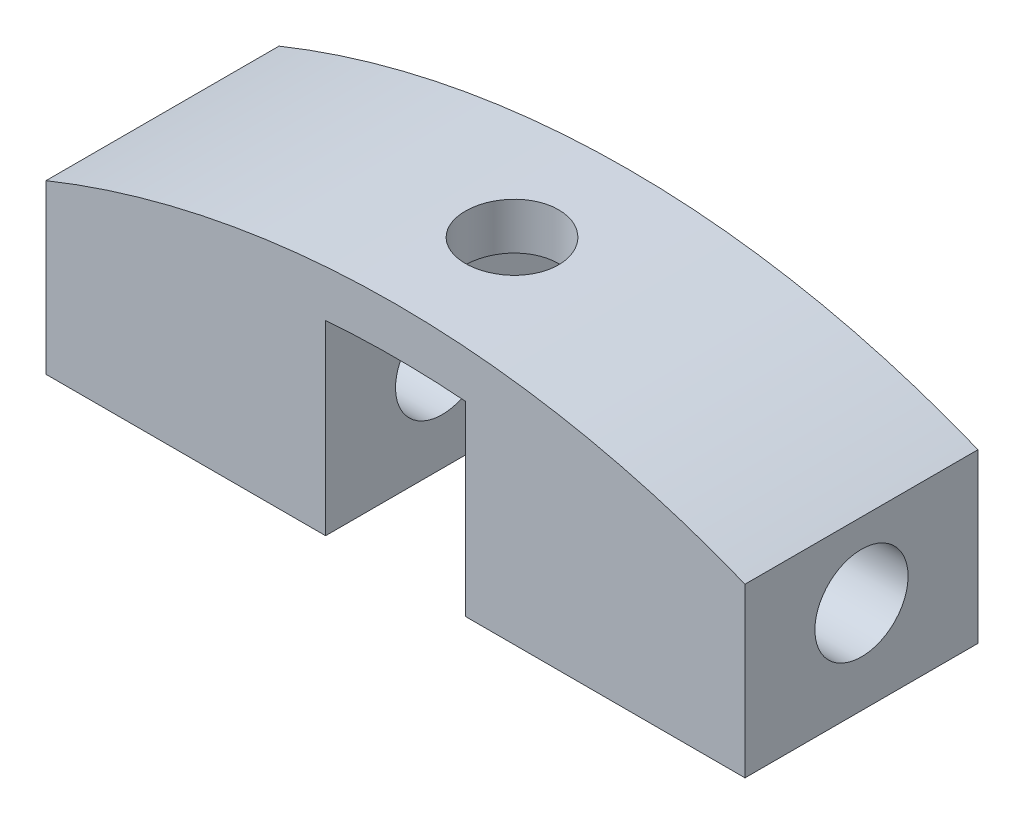
ISO-10303-21;
HEADER;
FILE_DESCRIPTION(('STEP AP214'),'2;1');
FILE_NAME('part.step','',(''),(''),'','','');
FILE_SCHEMA(('AUTOMOTIVE_DESIGN { 1 0 10303 214 1 1 1 1 }'));
ENDSEC;
DATA;
#1=APPLICATION_CONTEXT('core data for automotive mechanical design processes');
#2=APPLICATION_PROTOCOL_DEFINITION('international standard','automotive_design',2000,#1);
#3=PRODUCT_CONTEXT('',#1,'mechanical');
#4=PRODUCT('Part','Part','',(#3));
#5=PRODUCT_RELATED_PRODUCT_CATEGORY('part','',(#4));
#6=PRODUCT_DEFINITION_FORMATION('','',#4);
#7=PRODUCT_DEFINITION_CONTEXT('part definition',#1,'design');
#8=PRODUCT_DEFINITION('design','',#6,#7);
#9=PRODUCT_DEFINITION_SHAPE('','',#8);
#10=(LENGTH_UNIT() NAMED_UNIT(*) SI_UNIT(.MILLI.,.METRE.));
#11=(NAMED_UNIT(*) PLANE_ANGLE_UNIT() SI_UNIT($,.RADIAN.));
#12=(NAMED_UNIT(*) SI_UNIT($,.STERADIAN.) SOLID_ANGLE_UNIT());
#13=UNCERTAINTY_MEASURE_WITH_UNIT(LENGTH_MEASURE(1.E-05),#10,'distance_accuracy_value','');
#14=(GEOMETRIC_REPRESENTATION_CONTEXT(3) GLOBAL_UNCERTAINTY_ASSIGNED_CONTEXT((#13)) GLOBAL_UNIT_ASSIGNED_CONTEXT((#10,
#11,#12)) REPRESENTATION_CONTEXT('',''));
#15=CARTESIAN_POINT('',(0.,0.,0.));
#16=DIRECTION('',(0.,0.,1.));
#17=DIRECTION('',(1.,0.,0.));
#18=AXIS2_PLACEMENT_3D('',#15,#16,#17);
#19=CARTESIAN_POINT('',(0.,0.,-10.));
#20=DIRECTION('',(0.,0.,1.));
#21=DIRECTION('',(1.,0.,0.));
#22=AXIS2_PLACEMENT_3D('',#19,#20,#21);
#23=CYLINDRICAL_SURFACE('',#22,40.);
#24=CARTESIAN_POINT('',(0.,0.,0.));
#25=DIRECTION('',(0.,0.,1.));
#26=DIRECTION('',(1.,0.,0.));
#27=AXIS2_PLACEMENT_3D('',#24,#25,#26);
#28=CIRCLE('',#27,40.);
#29=CARTESIAN_POINT('',(-15.,37.0809924354783,0.));
#30=VERTEX_POINT('',#29);
#31=CARTESIAN_POINT('',(15.,37.0809924354783,0.));
#32=VERTEX_POINT('',#31);
#33=EDGE_CURVE('E147',#30,#32,#28,.F.);
#34=ORIENTED_EDGE('',*,*,#33,.T.);
#35=DIRECTION('',(0.,0.,1.));
#36=VECTOR('',#35,1.);
#37=CARTESIAN_POINT('',(15.,37.0809924354783,-10.));
#38=LINE('',#37,#36);
#39=CARTESIAN_POINT('',(15.,37.0809924354783,-10.));
#40=VERTEX_POINT('',#39);
#41=EDGE_CURVE('E11',#40,#32,#38,.T.);
#42=ORIENTED_EDGE('',*,*,#41,.F.);
#43=CARTESIAN_POINT('',(0.,0.,-10.));
#44=DIRECTION('',(0.,0.,1.));
#45=DIRECTION('',(1.,0.,0.));
#46=AXIS2_PLACEMENT_3D('',#43,#44,#45);
#47=CIRCLE('',#46,40.);
#48=CARTESIAN_POINT('',(-15.,37.0809924354783,-10.));
#49=VERTEX_POINT('',#48);
#50=EDGE_CURVE('E67',#49,#40,#47,.F.);
#51=ORIENTED_EDGE('',*,*,#50,.F.);
#52=DIRECTION('',(0.,0.,1.));
#53=VECTOR('',#52,1.);
#54=CARTESIAN_POINT('',(-15.,37.0809924354783,-10.));
#55=LINE('',#54,#53);
#56=EDGE_CURVE('E108',#49,#30,#55,.T.);
#57=ORIENTED_EDGE('',*,*,#56,.T.);
#58=EDGE_LOOP('',(#34,#42,#51,#57));
#59=FACE_BOUND('',#58,.T.);
#60=CARTESIAN_POINT('',(0.,40.,-7.));
#61=CARTESIAN_POINT('',(-0.112265616911048,39.9999993310588,-6.99999504538615));
#62=CARTESIAN_POINT('',(-0.224610849133379,39.9995223042568,-6.99051557564883));
#63=CARTESIAN_POINT('',(-0.446202106970096,39.9976652092002,-6.95283452638573));
#64=CARTESIAN_POINT('',(-0.555444322678372,39.9962840769828,-6.9246108879087));
#65=CARTESIAN_POINT('',(-0.767587516753999,39.992775092088,-6.85025159445374));
#66=CARTESIAN_POINT('',(-0.870491695889496,39.9906476200151,-6.80412506798111));
#67=CARTESIAN_POINT('',(-1.0670687455838,39.9858855602204,-6.69528338707365));
#68=CARTESIAN_POINT('',(-1.16074378814924,39.9832510922494,-6.63257214858503));
#69=CARTESIAN_POINT('',(-1.33632598574583,39.9777684271073,-6.49227065592492));
#70=CARTESIAN_POINT('',(-1.41822266811323,39.9749200431171,-6.41466730185758));
#71=CARTESIAN_POINT('',(-1.5678341577616,39.9693321871038,-6.24681060199339));
#72=CARTESIAN_POINT('',(-1.63554838571451,39.9665927195335,-6.15655673969704));
#73=CARTESIAN_POINT('',(-1.7549016777892,39.9615302934698,-5.96590606797041));
#74=CARTESIAN_POINT('',(-1.80653256433003,39.9592075471121,-5.86550413299776));
#75=CARTESIAN_POINT('',(-1.89220109729625,39.955242768929,-5.65744343680083));
#76=CARTESIAN_POINT('',(-1.92623887723075,39.9536007319379,-5.54978473065315));
#77=CARTESIAN_POINT('',(-1.97572732304413,39.9511842296725,-5.33036285978481));
#78=CARTESIAN_POINT('',(-1.9911936571644,39.9504090331057,-5.2186032370645));
#79=CARTESIAN_POINT('',(-2.00314852073654,39.9498114333411,-4.99407155185988));
#80=CARTESIAN_POINT('',(-1.99963719995224,39.9499890226245,-4.88129949737227));
#81=CARTESIAN_POINT('',(-1.97374948002459,39.9512762883718,-4.65805063420157));
#82=CARTESIAN_POINT('',(-1.95139001033191,39.9523851283809,-4.54757185690469));
#83=CARTESIAN_POINT('',(-1.88846693076793,39.9554086009528,-4.33193777192364));
#84=CARTESIAN_POINT('',(-1.84790324397276,39.9573232369207,-4.22678248673655));
#85=CARTESIAN_POINT('',(-1.74970385104569,39.9617434692129,-4.02472582254175));
#86=CARTESIAN_POINT('',(-1.69206042665314,39.964249332606,-3.92782820068195));
#87=CARTESIAN_POINT('',(-1.56134346775137,39.9695693120198,-3.74507852661144));
#88=CARTESIAN_POINT('',(-1.48826982434795,39.9723834302158,-3.659226552359));
#89=CARTESIAN_POINT('',(-1.32867118390875,39.9780064583275,-3.50090666011221));
#90=CARTESIAN_POINT('',(-1.2421315263715,39.9808153591497,-3.42845351988375));
#91=CARTESIAN_POINT('',(-1.05810892523511,39.9861083898039,-3.29910184883634));
#92=CARTESIAN_POINT('',(-0.960625978944193,39.9885925195558,-3.24220332184345));
#93=CARTESIAN_POINT('',(-0.757475340353876,39.9929561517216,-3.14557743555374));
#94=CARTESIAN_POINT('',(-0.651807402377382,39.9948356359779,-3.10585059191027));
#95=CARTESIAN_POINT('',(-0.435290141698447,39.9977778913425,-3.04470543140069));
#96=CARTESIAN_POINT('',(-0.324440857791477,39.998840668565,-3.02328697747315));
#97=CARTESIAN_POINT('',(-0.100835801441969,40.0000289471006,-2.99938480150285));
#98=CARTESIAN_POINT('',(0.0119177809093583,40.0001554602116,-2.99688063918612));
#99=CARTESIAN_POINT('',(0.236243547534334,39.999459638582,-3.01082478813196));
#100=CARTESIAN_POINT('',(0.347815735713991,39.9986373069794,-3.02727303671296));
#101=CARTESIAN_POINT('',(0.566554310425217,39.9961370686925,-3.07863818389485));
#102=CARTESIAN_POINT('',(0.673722893926904,39.9944595943818,-3.11354574950577));
#103=CARTESIAN_POINT('',(0.880679810996355,39.9904379315506,-3.20082917041223));
#104=CARTESIAN_POINT('',(0.980468102077105,39.9880937391924,-3.2532051262606));
#105=CARTESIAN_POINT('',(1.16992566379311,39.9829998301834,-3.37399089767236));
#106=CARTESIAN_POINT('',(1.25958618962161,39.9802497677389,-3.44241441503738));
#107=CARTESIAN_POINT('',(1.42615516033646,39.9746549811857,-3.59333299769423));
#108=CARTESIAN_POINT('',(1.5030635234061,39.9718102564698,-3.6758281532615));
#109=CARTESIAN_POINT('',(1.64201383621361,39.9663438905463,-3.85263620838711));
#110=CARTESIAN_POINT('',(1.7040425608833,39.9637224491183,-3.94695950830387));
#111=CARTESIAN_POINT('',(1.81138243847188,39.959001397661,-4.14469380571116));
#112=CARTESIAN_POINT('',(1.85669366414683,39.9569017853607,-4.24810476364895));
#113=CARTESIAN_POINT('',(1.92928926590117,39.9534625815024,-4.46102992338175));
#114=CARTESIAN_POINT('',(1.95658207301354,39.9521226345294,-4.57054124469516));
#115=CARTESIAN_POINT('',(1.99239367028111,39.950352862787,-4.79259881868402));
#116=CARTESIAN_POINT('',(2.00091256702397,39.9499230328505,-4.90514505412525));
#117=CARTESIAN_POINT('',(1.99893350883704,39.9500220946051,-5.12994603152679));
#118=CARTESIAN_POINT('',(1.98845635938041,39.9505499374029,-5.24220095770829));
#119=CARTESIAN_POINT('',(1.94882562334041,39.9525026363605,-5.46335597730274));
#120=CARTESIAN_POINT('',(1.91967200116263,39.9539274942299,-5.57225606432149));
#121=CARTESIAN_POINT('',(1.8435201320229,39.957513394848,-5.78361449319275));
#122=CARTESIAN_POINT('',(1.79652175410203,39.9596744429995,-5.88607278776386));
#123=CARTESIAN_POINT('',(1.68601807913173,39.9644890892628,-6.08164576679497));
#124=CARTESIAN_POINT('',(1.62251328855579,39.9671426722612,-6.17476073781877));
#125=CARTESIAN_POINT('',(1.48072496730499,39.9726466213336,-6.34910778902925));
#126=CARTESIAN_POINT('',(1.40242693454728,39.975497178751,-6.43032806876016));
#127=CARTESIAN_POINT('',(1.23328423979641,39.9810724487546,-6.57849671929589));
#128=CARTESIAN_POINT('',(1.14243649593039,39.983797130209,-6.6454415741354));
#129=CARTESIAN_POINT('',(0.950701902619183,39.9888155046257,-6.76319036062269));
#130=CARTESIAN_POINT('',(0.849805517457558,39.9911087821284,-6.81397876513819));
#131=CARTESIAN_POINT('',(0.640981745076913,39.9949997208313,-6.89783391708306));
#132=CARTESIAN_POINT('',(0.533062832578587,39.9965982032403,-6.93092159650999));
#133=CARTESIAN_POINT('',(0.353727852036429,39.9984966404118,-6.96975709699892));
#134=CARTESIAN_POINT('',(0.283473365616932,39.9990579226621,-6.98108370648269));
#135=CARTESIAN_POINT('',(0.142156561677926,39.9998098141077,-6.99620672357028));
#136=CARTESIAN_POINT('',(0.0710942448477645,40.0000004236192,-7.00000313759938));
#137=CARTESIAN_POINT('',(0.,40.,-7.));
#138=B_SPLINE_CURVE_WITH_KNOTS('',3,(#60,#61,#62,#63,#64,#65,#66,#67,#68,#69,#70,#71,#72,#73,
#74,#75,#76,#77,#78,#79,#80,#81,#82,#83,#84,#85,#86,#87,#88,#89,#90,#91,#92,#93,#94,#95,#96,#97,
#98,#99,#100,#101,#102,#103,#104,#105,#106,#107,#108,#109,#110,#111,#112,#113,#114,#115,#116,
#117,#118,#119,#120,#121,#122,#123,#124,#125,#126,#127,#128,#129,#130,#131,#132,#133,#134,#135,
#136,#137),.UNSPECIFIED.,.T.,.F.,(4,2,2,2,2,2,2,2,2,2,2,2,2,2,2,2,2,2,2,2,2,2,2,2,2,2,2,2,2,2,2,
2,2,2,2,2,2,2,4),(0.,0.336537330208492,0.673471415625031,1.0102339269084,1.34691699344225,
1.68389759324273,2.02089195541841,2.35805738387917,2.69522025364952,3.03209846764322,
3.36897402313642,3.70554731824559,4.04212203559462,4.37884908219658,4.71557850522954,
5.05267712546197,5.38977582861241,5.72688465389219,6.06399095546452,6.40073290120862,
6.73747373324478,7.07404447241389,7.41061714900934,7.74747825258439,8.08434151734545,
8.42150308697864,8.75866318923709,9.09566541823679,9.43266573392304,9.76929717200414,
10.1059292516535,10.4425638018228,10.7791880241058,11.1161439737318,11.4531828183021,
11.790544601777,12.1275065511194,12.3406251214153,12.5537435098637),.UNSPECIFIED.);
#139=CARTESIAN_POINT('',(0.,40.,-7.));
#140=VERTEX_POINT('',#139);
#141=EDGE_CURVE('E244',#140,#140,#138,.T.);
#142=ORIENTED_EDGE('',*,*,#141,.F.);
#143=EDGE_LOOP('',(#142));
#144=FACE_BOUND('',#143,.T.);
#145=ADVANCED_FACE('F43',(#59,#144),#23,.T.);
#146=CARTESIAN_POINT('',(0.,0.,-10.));
#147=DIRECTION('',(0.,0.,1.));
#148=DIRECTION('',(1.,0.,0.));
#149=AXIS2_PLACEMENT_3D('',#146,#147,#148);
#150=CYLINDRICAL_SURFACE('',#149,38.);
#151=CARTESIAN_POINT('',(0.,0.,0.));
#152=DIRECTION('',(0.,0.,1.));
#153=DIRECTION('',(1.,0.,0.));
#154=AXIS2_PLACEMENT_3D('',#151,#152,#153);
#155=CIRCLE('',#154,38.);
#156=CARTESIAN_POINT('',(-3.,37.8813938497516,0.));
#157=VERTEX_POINT('',#156);
#158=CARTESIAN_POINT('',(3.,37.8813938497516,0.));
#159=VERTEX_POINT('',#158);
#160=EDGE_CURVE('E159',#157,#159,#155,.F.);
#161=ORIENTED_EDGE('',*,*,#160,.F.);
#162=DIRECTION('',(0.,0.,1.));
#163=VECTOR('',#162,1.);
#164=CARTESIAN_POINT('',(-3.,37.8813938497516,-10.));
#165=LINE('',#164,#163);
#166=CARTESIAN_POINT('',(-3.,37.8813938497516,-10.));
#167=VERTEX_POINT('',#166);
#168=EDGE_CURVE('E170',#167,#157,#165,.T.);
#169=ORIENTED_EDGE('',*,*,#168,.F.);
#170=CARTESIAN_POINT('',(0.,0.,-10.));
#171=DIRECTION('',(0.,0.,1.));
#172=DIRECTION('',(1.,0.,0.));
#173=AXIS2_PLACEMENT_3D('',#170,#171,#172);
#174=CIRCLE('',#173,38.);
#175=CARTESIAN_POINT('',(3.,37.8813938497516,-10.));
#176=VERTEX_POINT('',#175);
#177=EDGE_CURVE('E140',#167,#176,#174,.F.);
#178=ORIENTED_EDGE('',*,*,#177,.T.);
#179=DIRECTION('',(0.,0.,1.));
#180=VECTOR('',#179,1.);
#181=CARTESIAN_POINT('',(3.,37.8813938497516,-10.));
#182=LINE('',#181,#180);
#183=EDGE_CURVE('E130',#176,#159,#182,.T.);
#184=ORIENTED_EDGE('',*,*,#183,.T.);
#185=EDGE_LOOP('',(#161,#169,#178,#184));
#186=FACE_BOUND('',#185,.T.);
#187=CARTESIAN_POINT('',(0.,38.,-7.));
#188=CARTESIAN_POINT('',(-0.112257494975113,37.9999992967016,-6.99999504852329));
#189=CARTESIAN_POINT('',(-0.224594406096478,37.9994972366155,-6.990516944809));
#190=CARTESIAN_POINT('',(-0.446168694204235,37.997542685662,-6.95284163796938));
#191=CARTESIAN_POINT('',(-0.555402270169906,37.9960890776103,-6.92462243090432));
#192=CARTESIAN_POINT('',(-0.767528142710374,37.9923959390285,-6.8502755983983));
#193=CARTESIAN_POINT('',(-0.870423661467143,37.9901568117876,-6.80415716121867));
#194=CARTESIAN_POINT('',(-1.06698510061024,37.9851447491956,-6.69533527173343));
#195=CARTESIAN_POINT('',(-1.16065318017412,37.9823719391744,-6.63263571204523));
#196=CARTESIAN_POINT('',(-1.33623194118642,37.9766009654461,-6.49235464012574));
#197=CARTESIAN_POINT('',(-1.41813115766986,37.9736025862679,-6.41475878581834));
#198=CARTESIAN_POINT('',(-1.56774958900335,37.9677202635687,-6.24691665771106));
#199=CARTESIAN_POINT('',(-1.63546822208943,37.9648363247467,-6.15666986515499));
#200=CARTESIAN_POINT('',(-1.75483576144579,37.9595065365249,-5.96602627489949));
#201=CARTESIAN_POINT('',(-1.80647556946915,37.9570609354907,-5.86562377297766));
#202=CARTESIAN_POINT('',(-1.89216126489218,37.9528862755447,-5.65755893684705));
#203=CARTESIAN_POINT('',(-1.92620729647581,37.9511572107608,-5.54989666214151));
#204=CARTESIAN_POINT('',(-1.97570831620216,37.948612581642,-5.33047516989354));
#205=CARTESIAN_POINT('',(-1.99118066612294,37.9477961642576,-5.21871987918231));
#206=CARTESIAN_POINT('',(-2.00314869285286,37.9471663365113,-4.99419553131426));
#207=CARTESIAN_POINT('',(-1.99964453192352,37.9473529175731,-4.88142648283396));
#208=CARTESIAN_POINT('',(-1.97377345691859,37.948707253516,-4.65819378465463));
#209=CARTESIAN_POINT('',(-1.95142530675154,37.9498740323606,-4.54772795361026));
#210=CARTESIAN_POINT('',(-1.88852971849363,37.9530557228339,-4.33211785874605));
#211=CARTESIAN_POINT('',(-1.84798219730912,37.955070638335,-4.22697361922566));
#212=CARTESIAN_POINT('',(-1.74981745750645,37.9597226343356,-4.02493094657778));
#213=CARTESIAN_POINT('',(-1.69219169244275,37.9623600262053,-3.92803667329777));
#214=CARTESIAN_POINT('',(-1.5615124678309,37.967959407137,-3.74528989937701));
#215=CARTESIAN_POINT('',(-1.48845888699444,37.9709213987506,-3.65943748555219));
#216=CARTESIAN_POINT('',(-1.32889190569762,37.9768404806039,-3.50110226129715));
#217=CARTESIAN_POINT('',(-1.24236225828257,37.9797975605146,-3.42863582281481));
#218=CARTESIAN_POINT('',(-1.05835647390502,37.9853700712461,-3.2992557872688));
#219=CARTESIAN_POINT('',(-0.9608803340562,37.9879855019767,-3.24234219430604));
#220=CARTESIAN_POINT('',(-0.75773890895872,37.9925800914482,-3.14568495176168));
#221=CARTESIAN_POINT('',(-0.652073346901402,37.9945592286701,-3.10594188285553));
#222=CARTESIAN_POINT('',(-0.435556818647378,37.9976578769295,-3.0447645945624));
#223=CARTESIAN_POINT('',(-0.324705895451017,37.9987773950941,-3.02333022337631));
#224=CARTESIAN_POINT('',(-0.101107409875226,38.0000297209003,-2.99939897279629));
#225=CARTESIAN_POINT('',(0.011637722704661,38.0001637083464,-2.99687944987166));
#226=CARTESIAN_POINT('',(0.235949136708397,37.9994330060251,-3.01079030989939));
#227=CARTESIAN_POINT('',(0.347515422458253,37.998568319924,-3.02722062328727));
#228=CARTESIAN_POINT('',(0.566238670235006,37.9959384121677,-3.0785460167489));
#229=CARTESIAN_POINT('',(0.673398067232668,37.9941736952387,-3.1134307482227));
#230=CARTESIAN_POINT('',(0.880340712319506,37.9899423804774,-3.2006642333431));
#231=CARTESIAN_POINT('',(0.980123913327141,37.9874757781655,-3.25301309844981));
#232=CARTESIAN_POINT('',(1.16958560557093,37.98211517123,-3.37374676842648));
#233=CARTESIAN_POINT('',(1.25925441942309,37.979220763299,-3.44214674139311));
#234=CARTESIAN_POINT('',(1.42584464316413,37.9733318141657,-3.59301885781896));
#235=CARTESIAN_POINT('',(1.50276596290104,37.9703372722555,-3.67549110079077));
#236=CARTESIAN_POINT('',(1.64175400867773,37.9645821929165,-3.85226413782689));
#237=CARTESIAN_POINT('',(1.70380607662385,37.9618218881151,-3.94657646543707));
#238=CARTESIAN_POINT('',(1.81119399063317,37.9568502192247,-4.14429427566385));
#239=CARTESIAN_POINT('',(1.85652991530996,37.9546388525541,-4.24769971551404));
#240=CARTESIAN_POINT('',(1.92917309720029,37.9510160928557,-4.46061429147294));
#241=CARTESIAN_POINT('',(1.95648967605756,37.9496042862587,-4.57012023986207));
#242=CARTESIAN_POINT('',(1.99234922825347,37.9477386931124,-4.79217190555056));
#243=CARTESIAN_POINT('',(2.00089232344975,37.9472849003447,-4.90471760311427));
#244=CARTESIAN_POINT('',(1.99896125099149,37.9473866608667,-5.12950813715861));
#245=CARTESIAN_POINT('',(1.98851013941898,37.9479409904494,-5.24175317298852));
#246=CARTESIAN_POINT('',(1.94893501007856,37.9499939334457,-5.46289262079623));
#247=CARTESIAN_POINT('',(1.91981095702404,37.9514925486437,-5.57178702644187));
#248=CARTESIAN_POINT('',(1.84372148982822,37.9552648812545,-5.7831386252057));
#249=CARTESIAN_POINT('',(1.79675598635249,37.9575386025483,-5.88559578608879));
#250=CARTESIAN_POINT('',(1.68632056233328,37.9626048231445,-6.08117256732967));
#251=CARTESIAN_POINT('',(1.62285113299039,37.9653973070063,-6.17429246547489));
#252=CARTESIAN_POINT('',(1.48112622144312,37.9711902154659,-6.34866702683486));
#253=CARTESIAN_POINT('',(1.40285450581593,37.9741908660473,-6.42990848806656));
#254=CARTESIAN_POINT('',(1.23376060343086,37.9800602378797,-6.57812421878285));
#255=CARTESIAN_POINT('',(1.14293533714121,37.9829289265281,-6.64509497722088));
#256=CARTESIAN_POINT('',(0.951235117490945,37.9882132927648,-6.76290298799755));
#257=CARTESIAN_POINT('',(0.850350093999288,37.9906285092999,-6.81372385640457));
#258=CARTESIAN_POINT('',(0.641541738946326,37.9947270460173,-6.89764500275061));
#259=CARTESIAN_POINT('',(0.533626876739454,37.9964112288375,-6.93076617749575));
#260=CARTESIAN_POINT('',(0.35420290377082,37.9984132523255,-6.96967519821479));
#261=CARTESIAN_POINT('',(0.283855510602708,37.9990056620462,-6.98103244489239));
#262=CARTESIAN_POINT('',(0.142349390845815,37.9997992587036,-6.99619641223682));
#263=CARTESIAN_POINT('',(0.0711906650295708,38.0000004460128,-7.00000314009252));
#264=CARTESIAN_POINT('',(0.,38.,-7.));
#265=B_SPLINE_CURVE_WITH_KNOTS('',3,(#187,#188,#189,#190,#191,#192,#193,#194,#195,#196,#197,
#198,#199,#200,#201,#202,#203,#204,#205,#206,#207,#208,#209,#210,#211,#212,#213,#214,#215,#216,
#217,#218,#219,#220,#221,#222,#223,#224,#225,#226,#227,#228,#229,#230,#231,#232,#233,#234,#235,
#236,#237,#238,#239,#240,#241,#242,#243,#244,#245,#246,#247,#248,#249,#250,#251,#252,#253,#254,
#255,#256,#257,#258,#259,#260,#261,#262,#263,#264),.UNSPECIFIED.,.T.,.F.,(4,2,2,2,2,2,2,2,2,2,2,
2,2,2,2,2,2,2,2,2,2,2,2,2,2,2,2,2,2,2,2,2,2,2,2,2,2,2,4),(0.,0.336512609448253,
0.673421018682362,1.01015671004803,1.3468134187397,1.68379589929941,2.02079220198942,
2.35797884985527,2.6951627343756,3.03203118969306,3.36889676457028,3.7054273010185,
4.04195937399412,4.37866014251154,4.71536355815613,5.05247609677582,5.38958872428373,
5.72671275142657,6.06383398341583,6.40055157304011,6.73726792658455,7.07379566107478,
7.41032554340328,7.74717473209635,8.08402630293009,8.4212085880522,8.75838928743498,
9.09539542174656,9.43239936856332,9.76899451695729,10.1055903014234,10.4421877712899,
10.7787752242696,11.1157339705313,11.4527755238811,11.7901579195656,12.1271411061742,
12.3405484984545,12.5539556875492),.UNSPECIFIED.);
#266=CARTESIAN_POINT('',(0.,38.,-7.));
#267=VERTEX_POINT('',#266);
#268=EDGE_CURVE('E47',#267,#267,#265,.T.);
#269=ORIENTED_EDGE('',*,*,#268,.T.);
#270=EDGE_LOOP('',(#269));
#271=FACE_BOUND('',#270,.T.);
#272=ADVANCED_FACE('F194',(#186,#271),#150,.F.);
#273=CARTESIAN_POINT('',(15.,0.,-10.));
#274=DIRECTION('',(1.,0.,0.));
#275=DIRECTION('',(0.,1.,0.));
#276=AXIS2_PLACEMENT_3D('',#273,#274,#275);
#277=PLANE('',#276);
#278=CARTESIAN_POINT('',(15.,33.8813938497516,-5.));
#279=DIRECTION('',(1.,0.,0.));
#280=DIRECTION('',(0.,1.,0.));
#281=AXIS2_PLACEMENT_3D('',#278,#279,#280);
#282=CIRCLE('',#281,2.);
#283=CARTESIAN_POINT('',(15.,35.8813938497516,-5.));
#284=VERTEX_POINT('',#283);
#285=EDGE_CURVE('E250',#284,#284,#282,.T.);
#286=ORIENTED_EDGE('',*,*,#285,.F.);
#287=EDGE_LOOP('',(#286));
#288=FACE_BOUND('',#287,.T.);
#289=DIRECTION('',(0.,1.,0.));
#290=VECTOR('',#289,1.);
#291=CARTESIAN_POINT('',(15.,0.,0.));
#292=LINE('',#291,#290);
#293=CARTESIAN_POINT('',(15.,29.8813938497516,0.));
#294=VERTEX_POINT('',#293);
#295=EDGE_CURVE('E165',#294,#32,#292,.T.);
#296=ORIENTED_EDGE('',*,*,#295,.F.);
#297=DIRECTION('',(0.,0.,1.));
#298=VECTOR('',#297,1.);
#299=CARTESIAN_POINT('',(15.,29.8813938497516,-10.));
#300=LINE('',#299,#298);
#301=CARTESIAN_POINT('',(15.,29.8813938497516,-10.));
#302=VERTEX_POINT('',#301);
#303=EDGE_CURVE('E58',#302,#294,#300,.T.);
#304=ORIENTED_EDGE('',*,*,#303,.F.);
#305=DIRECTION('',(0.,1.,0.));
#306=VECTOR('',#305,1.);
#307=CARTESIAN_POINT('',(15.,0.,-10.));
#308=LINE('',#307,#306);
#309=EDGE_CURVE('E137',#302,#40,#308,.T.);
#310=ORIENTED_EDGE('',*,*,#309,.T.);
#311=ORIENTED_EDGE('',*,*,#41,.T.);
#312=EDGE_LOOP('',(#296,#304,#310,#311));
#313=FACE_BOUND('',#312,.T.);
#314=ADVANCED_FACE('F196',(#288,#313),#277,.T.);
#315=CARTESIAN_POINT('',(0.,29.8813938497516,-10.));
#316=DIRECTION('',(0.,-1.,0.));
#317=DIRECTION('',(0.,0.,-1.));
#318=AXIS2_PLACEMENT_3D('',#315,#316,#317);
#319=PLANE('',#318);
#320=DIRECTION('',(1.,0.,0.));
#321=VECTOR('',#320,1.);
#322=CARTESIAN_POINT('',(0.,29.8813938497516,0.));
#323=LINE('',#322,#321);
#324=CARTESIAN_POINT('',(3.,29.8813938497516,0.));
#325=VERTEX_POINT('',#324);
#326=EDGE_CURVE('E125',#325,#294,#323,.T.);
#327=ORIENTED_EDGE('',*,*,#326,.F.);
#328=DIRECTION('',(0.,0.,1.));
#329=VECTOR('',#328,1.);
#330=CARTESIAN_POINT('',(3.,29.8813938497516,-10.));
#331=LINE('',#330,#329);
#332=CARTESIAN_POINT('',(3.,29.8813938497516,-10.));
#333=VERTEX_POINT('',#332);
#334=EDGE_CURVE('E121',#333,#325,#331,.T.);
#335=ORIENTED_EDGE('',*,*,#334,.F.);
#336=DIRECTION('',(1.,0.,0.));
#337=VECTOR('',#336,1.);
#338=CARTESIAN_POINT('',(0.,29.8813938497516,-10.));
#339=LINE('',#338,#337);
#340=EDGE_CURVE('E124',#333,#302,#339,.T.);
#341=ORIENTED_EDGE('',*,*,#340,.T.);
#342=ORIENTED_EDGE('',*,*,#303,.T.);
#343=EDGE_LOOP('',(#327,#335,#341,#342));
#344=FACE_BOUND('',#343,.T.);
#345=ADVANCED_FACE('F123',(#344),#319,.T.);
#346=CARTESIAN_POINT('',(3.00000000000001,0.,-10.));
#347=DIRECTION('',(-1.,0.,0.));
#348=DIRECTION('',(0.,-1.,0.));
#349=AXIS2_PLACEMENT_3D('',#346,#347,#348);
#350=PLANE('',#349);
#351=CARTESIAN_POINT('',(3.,33.8813938497516,-5.));
#352=DIRECTION('',(-1.,0.,0.));
#353=DIRECTION('',(0.,-1.,0.));
#354=AXIS2_PLACEMENT_3D('',#351,#352,#353);
#355=CIRCLE('',#354,2.);
#356=CARTESIAN_POINT('',(3.,31.8813938497516,-5.));
#357=VERTEX_POINT('',#356);
#358=EDGE_CURVE('E150',#357,#357,#355,.T.);
#359=ORIENTED_EDGE('',*,*,#358,.F.);
#360=EDGE_LOOP('',(#359));
#361=FACE_BOUND('',#360,.T.);
#362=DIRECTION('',(0.,-1.,0.));
#363=VECTOR('',#362,1.);
#364=CARTESIAN_POINT('',(3.00000000000001,0.,0.));
#365=LINE('',#364,#363);
#366=EDGE_CURVE('E162',#159,#325,#365,.T.);
#367=ORIENTED_EDGE('',*,*,#366,.F.);
#368=ORIENTED_EDGE('',*,*,#183,.F.);
#369=DIRECTION('',(0.,-1.,0.));
#370=VECTOR('',#369,1.);
#371=CARTESIAN_POINT('',(3.00000000000001,0.,-10.));
#372=LINE('',#371,#370);
#373=EDGE_CURVE('E135',#176,#333,#372,.T.);
#374=ORIENTED_EDGE('',*,*,#373,.T.);
#375=ORIENTED_EDGE('',*,*,#334,.T.);
#376=EDGE_LOOP('',(#367,#368,#374,#375));
#377=FACE_BOUND('',#376,.T.);
#378=ADVANCED_FACE('F139',(#361,#377),#350,.T.);
#379=CARTESIAN_POINT('',(-3.00000000000001,0.,-10.));
#380=DIRECTION('',(1.,0.,0.));
#381=DIRECTION('',(0.,1.,0.));
#382=AXIS2_PLACEMENT_3D('',#379,#380,#381);
#383=PLANE('',#382);
#384=CARTESIAN_POINT('',(-3.,33.8813938497516,-5.));
#385=DIRECTION('',(1.,0.,0.));
#386=DIRECTION('',(0.,1.,0.));
#387=AXIS2_PLACEMENT_3D('',#384,#385,#386);
#388=CIRCLE('',#387,2.);
#389=CARTESIAN_POINT('',(-3.,35.8813938497516,-5.));
#390=VERTEX_POINT('',#389);
#391=EDGE_CURVE('E256',#390,#390,#388,.T.);
#392=ORIENTED_EDGE('',*,*,#391,.F.);
#393=EDGE_LOOP('',(#392));
#394=FACE_BOUND('',#393,.T.);
#395=DIRECTION('',(0.,1.,0.));
#396=VECTOR('',#395,1.);
#397=CARTESIAN_POINT('',(-3.00000000000001,0.,0.));
#398=LINE('',#397,#396);
#399=CARTESIAN_POINT('',(-3.,29.8813938497516,0.));
#400=VERTEX_POINT('',#399);
#401=EDGE_CURVE('E156',#400,#157,#398,.T.);
#402=ORIENTED_EDGE('',*,*,#401,.F.);
#403=DIRECTION('',(0.,0.,1.));
#404=VECTOR('',#403,1.);
#405=CARTESIAN_POINT('',(-3.,29.8813938497516,-10.));
#406=LINE('',#405,#404);
#407=CARTESIAN_POINT('',(-3.,29.8813938497516,-10.));
#408=VERTEX_POINT('',#407);
#409=EDGE_CURVE('E172',#408,#400,#406,.T.);
#410=ORIENTED_EDGE('',*,*,#409,.F.);
#411=DIRECTION('',(0.,1.,0.));
#412=VECTOR('',#411,1.);
#413=CARTESIAN_POINT('',(-3.00000000000001,0.,-10.));
#414=LINE('',#413,#412);
#415=EDGE_CURVE('E142',#408,#167,#414,.T.);
#416=ORIENTED_EDGE('',*,*,#415,.T.);
#417=ORIENTED_EDGE('',*,*,#168,.T.);
#418=EDGE_LOOP('',(#402,#410,#416,#417));
#419=FACE_BOUND('',#418,.T.);
#420=ADVANCED_FACE('F190',(#394,#419),#383,.T.);
#421=CARTESIAN_POINT('',(0.,29.8813938497516,-10.));
#422=DIRECTION('',(0.,-1.,0.));
#423=DIRECTION('',(0.,0.,-1.));
#424=AXIS2_PLACEMENT_3D('',#421,#422,#423);
#425=PLANE('',#424);
#426=DIRECTION('',(1.,0.,0.));
#427=VECTOR('',#426,1.);
#428=CARTESIAN_POINT('',(0.,29.8813938497516,0.));
#429=LINE('',#428,#427);
#430=CARTESIAN_POINT('',(-15.,29.8813938497516,0.));
#431=VERTEX_POINT('',#430);
#432=EDGE_CURVE('E153',#431,#400,#429,.T.);
#433=ORIENTED_EDGE('',*,*,#432,.F.);
#434=DIRECTION('',(0.,0.,1.));
#435=VECTOR('',#434,1.);
#436=CARTESIAN_POINT('',(-15.,29.8813938497516,-10.));
#437=LINE('',#436,#435);
#438=CARTESIAN_POINT('',(-15.,29.8813938497516,-10.));
#439=VERTEX_POINT('',#438);
#440=EDGE_CURVE('E174',#439,#431,#437,.T.);
#441=ORIENTED_EDGE('',*,*,#440,.F.);
#442=DIRECTION('',(1.,0.,0.));
#443=VECTOR('',#442,1.);
#444=CARTESIAN_POINT('',(0.,29.8813938497516,-10.));
#445=LINE('',#444,#443);
#446=EDGE_CURVE('E263',#439,#408,#445,.T.);
#447=ORIENTED_EDGE('',*,*,#446,.T.);
#448=ORIENTED_EDGE('',*,*,#409,.T.);
#449=EDGE_LOOP('',(#433,#441,#447,#448));
#450=FACE_BOUND('',#449,.T.);
#451=ADVANCED_FACE('F186',(#450),#425,.T.);
#452=CARTESIAN_POINT('',(-15.,0.,-10.));
#453=DIRECTION('',(-1.,0.,0.));
#454=DIRECTION('',(0.,-1.,0.));
#455=AXIS2_PLACEMENT_3D('',#452,#453,#454);
#456=PLANE('',#455);
#457=CARTESIAN_POINT('',(-15.,33.8813938497516,-5.));
#458=DIRECTION('',(1.,0.,0.));
#459=DIRECTION('',(0.,1.,0.));
#460=AXIS2_PLACEMENT_3D('',#457,#458,#459);
#461=CIRCLE('',#460,2.);
#462=CARTESIAN_POINT('',(-15.,35.8813938497516,-5.));
#463=VERTEX_POINT('',#462);
#464=EDGE_CURVE('E253',#463,#463,#461,.T.);
#465=ORIENTED_EDGE('',*,*,#464,.T.);
#466=EDGE_LOOP('',(#465));
#467=FACE_BOUND('',#466,.T.);
#468=DIRECTION('',(0.,-1.,0.));
#469=VECTOR('',#468,1.);
#470=CARTESIAN_POINT('',(-15.,0.,0.));
#471=LINE('',#470,#469);
#472=EDGE_CURVE('E149',#30,#431,#471,.T.);
#473=ORIENTED_EDGE('',*,*,#472,.F.);
#474=ORIENTED_EDGE('',*,*,#56,.F.);
#475=DIRECTION('',(0.,-1.,0.));
#476=VECTOR('',#475,1.);
#477=CARTESIAN_POINT('',(-15.,0.,-10.));
#478=LINE('',#477,#476);
#479=EDGE_CURVE('E182',#49,#439,#478,.T.);
#480=ORIENTED_EDGE('',*,*,#479,.T.);
#481=ORIENTED_EDGE('',*,*,#440,.T.);
#482=EDGE_LOOP('',(#473,#474,#480,#481));
#483=FACE_BOUND('',#482,.T.);
#484=ADVANCED_FACE('F180',(#467,#483),#456,.T.);
#485=CARTESIAN_POINT('',(0.,0.,-10.));
#486=DIRECTION('',(0.,0.,1.));
#487=DIRECTION('',(1.,0.,0.));
#488=AXIS2_PLACEMENT_3D('',#485,#486,#487);
#489=PLANE('',#488);
#490=ORIENTED_EDGE('',*,*,#50,.T.);
#491=ORIENTED_EDGE('',*,*,#309,.F.);
#492=ORIENTED_EDGE('',*,*,#340,.F.);
#493=ORIENTED_EDGE('',*,*,#373,.F.);
#494=ORIENTED_EDGE('',*,*,#177,.F.);
#495=ORIENTED_EDGE('',*,*,#415,.F.);
#496=ORIENTED_EDGE('',*,*,#446,.F.);
#497=ORIENTED_EDGE('',*,*,#479,.F.);
#498=EDGE_LOOP('',(#490,#491,#492,#493,#494,#495,#496,#497));
#499=FACE_BOUND('',#498,.T.);
#500=ADVANCED_FACE('F133',(#499),#489,.F.);
#501=CARTESIAN_POINT('',(0.,0.,0.));
#502=DIRECTION('',(0.,0.,1.));
#503=DIRECTION('',(1.,0.,0.));
#504=AXIS2_PLACEMENT_3D('',#501,#502,#503);
#505=PLANE('',#504);
#506=ORIENTED_EDGE('',*,*,#33,.F.);
#507=ORIENTED_EDGE('',*,*,#472,.T.);
#508=ORIENTED_EDGE('',*,*,#432,.T.);
#509=ORIENTED_EDGE('',*,*,#401,.T.);
#510=ORIENTED_EDGE('',*,*,#160,.T.);
#511=ORIENTED_EDGE('',*,*,#366,.T.);
#512=ORIENTED_EDGE('',*,*,#326,.T.);
#513=ORIENTED_EDGE('',*,*,#295,.T.);
#514=EDGE_LOOP('',(#506,#507,#508,#509,#510,#511,#512,#513));
#515=FACE_BOUND('',#514,.T.);
#516=ADVANCED_FACE('F179',(#515),#505,.T.);
#517=CARTESIAN_POINT('',(-15.,33.8813938497516,-5.));
#518=DIRECTION('',(1.,0.,0.));
#519=DIRECTION('',(0.,1.,0.));
#520=AXIS2_PLACEMENT_3D('',#517,#518,#519);
#521=CYLINDRICAL_SURFACE('',#520,2.);
#522=ORIENTED_EDGE('',*,*,#391,.T.);
#523=EDGE_LOOP('',(#522));
#524=FACE_BOUND('',#523,.T.);
#525=ORIENTED_EDGE('',*,*,#464,.F.);
#526=EDGE_LOOP('',(#525));
#527=FACE_BOUND('',#526,.T.);
#528=ADVANCED_FACE('F235',(#524,#527),#521,.F.);
#529=ORIENTED_EDGE('',*,*,#358,.T.);
#530=EDGE_LOOP('',(#529));
#531=FACE_BOUND('',#530,.T.);
#532=ORIENTED_EDGE('',*,*,#285,.T.);
#533=EDGE_LOOP('',(#532));
#534=FACE_BOUND('',#533,.T.);
#535=ADVANCED_FACE('F218',(#531,#534),#521,.F.);
#536=CARTESIAN_POINT('',(0.,40.,-5.));
#537=DIRECTION('',(0.,-1.,0.));
#538=DIRECTION('',(0.,0.,-1.));
#539=AXIS2_PLACEMENT_3D('',#536,#537,#538);
#540=CYLINDRICAL_SURFACE('',#539,2.);
#541=ORIENTED_EDGE('',*,*,#268,.F.);
#542=EDGE_LOOP('',(#541));
#543=FACE_BOUND('',#542,.T.);
#544=ORIENTED_EDGE('',*,*,#141,.T.);
#545=EDGE_LOOP('',(#544));
#546=FACE_BOUND('',#545,.T.);
#547=ADVANCED_FACE('F227',(#543,#546),#540,.F.);
#548=CLOSED_SHELL('',(#145,#272,#314,#345,#378,#420,#451,#484,#500,#516,#528,#535,#547));
#549=MANIFOLD_SOLID_BREP('B2',#548);
#550=ADVANCED_BREP_SHAPE_REPRESENTATION('',(#18,#549),#14);
#551=SHAPE_DEFINITION_REPRESENTATION(#9,#550);
ENDSEC;
END-ISO-10303-21;
